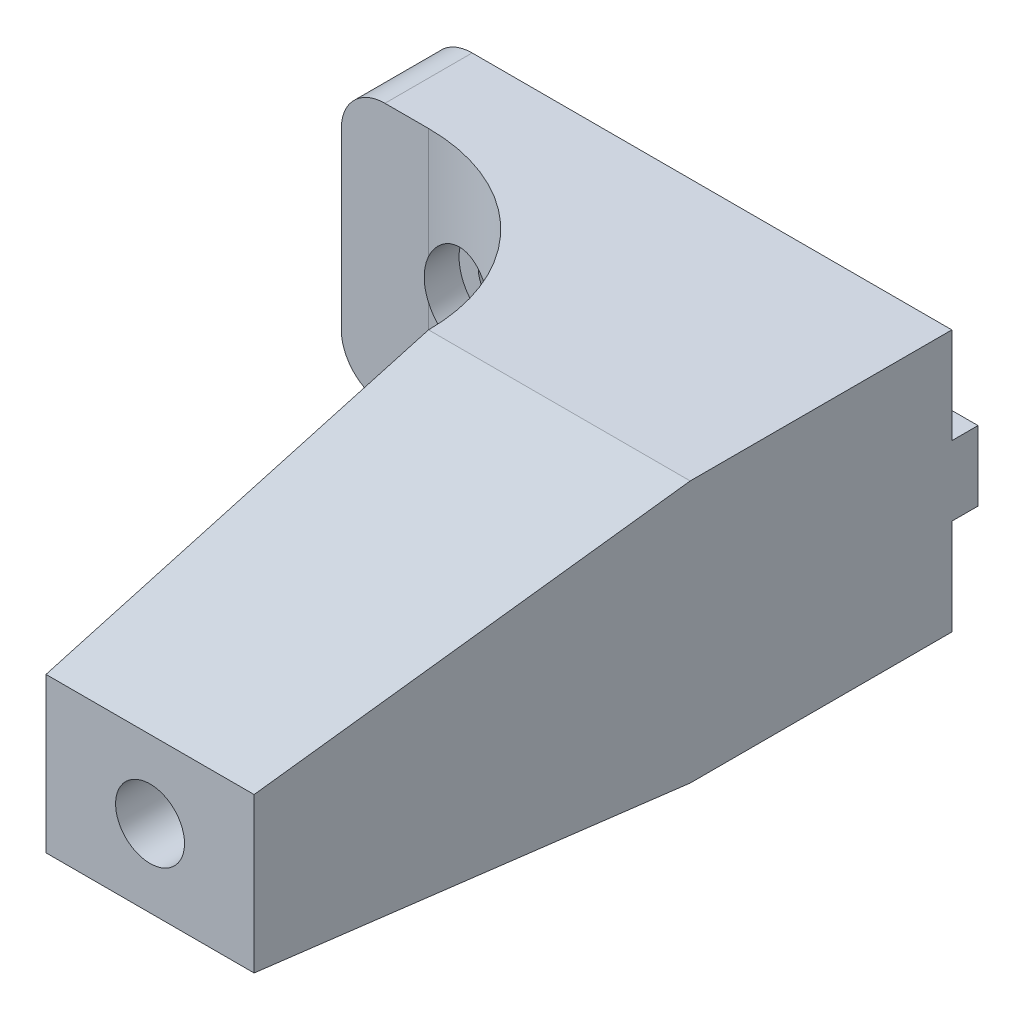
ISO-10303-21;
HEADER;
FILE_DESCRIPTION(('STEP AP214'),'2;1');
FILE_NAME('part.step','',(''),(''),'','','');
FILE_SCHEMA(('AUTOMOTIVE_DESIGN { 1 0 10303 214 1 1 1 1 }'));
ENDSEC;
DATA;
#1=APPLICATION_CONTEXT('core data for automotive mechanical design processes');
#2=APPLICATION_PROTOCOL_DEFINITION('international standard','automotive_design',2000,#1);
#3=PRODUCT_CONTEXT('',#1,'mechanical');
#4=PRODUCT('Part','Part','',(#3));
#5=PRODUCT_RELATED_PRODUCT_CATEGORY('part','',(#4));
#6=PRODUCT_DEFINITION_FORMATION('','',#4);
#7=PRODUCT_DEFINITION_CONTEXT('part definition',#1,'design');
#8=PRODUCT_DEFINITION('design','',#6,#7);
#9=PRODUCT_DEFINITION_SHAPE('','',#8);
#10=(LENGTH_UNIT() NAMED_UNIT(*) SI_UNIT(.MILLI.,.METRE.));
#11=(NAMED_UNIT(*) PLANE_ANGLE_UNIT() SI_UNIT($,.RADIAN.));
#12=(NAMED_UNIT(*) SI_UNIT($,.STERADIAN.) SOLID_ANGLE_UNIT());
#13=UNCERTAINTY_MEASURE_WITH_UNIT(LENGTH_MEASURE(1.E-05),#10,'distance_accuracy_value','');
#14=(GEOMETRIC_REPRESENTATION_CONTEXT(3) GLOBAL_UNCERTAINTY_ASSIGNED_CONTEXT((#13)) GLOBAL_UNIT_ASSIGNED_CONTEXT((#10,
#11,#12)) REPRESENTATION_CONTEXT('',''));
#15=CARTESIAN_POINT('',(0.,0.,0.));
#16=DIRECTION('',(0.,0.,1.));
#17=DIRECTION('',(1.,0.,0.));
#18=AXIS2_PLACEMENT_3D('',#15,#16,#17);
#19=CARTESIAN_POINT('',(0.,0.,0.));
#20=DIRECTION('',(0.,0.,1.));
#21=DIRECTION('',(1.,0.,0.));
#22=AXIS2_PLACEMENT_3D('',#19,#20,#21);
#23=PLANE('',#22);
#24=CARTESIAN_POINT('',(-15.,0.,0.));
#25=DIRECTION('',(0.,0.,1.));
#26=DIRECTION('',(1.,0.,0.));
#27=AXIS2_PLACEMENT_3D('',#24,#25,#26);
#28=CIRCLE('',#27,3.29999999999999);
#29=CARTESIAN_POINT('',(-11.7,0.,0.));
#30=VERTEX_POINT('',#29);
#31=EDGE_CURVE('E254',#30,#30,#28,.T.);
#32=ORIENTED_EDGE('',*,*,#31,.T.);
#33=EDGE_LOOP('',(#32));
#34=FACE_BOUND('',#33,.T.);
#35=DIRECTION('',(0.,-1.,0.));
#36=VECTOR('',#35,1.);
#37=CARTESIAN_POINT('',(-30.,15.,0.));
#38=LINE('',#37,#36);
#39=CARTESIAN_POINT('',(-30.,10.,0.));
#40=VERTEX_POINT('',#39);
#41=CARTESIAN_POINT('',(-30.,4.,0.));
#42=VERTEX_POINT('',#41);
#43=EDGE_CURVE('E277',#40,#42,#38,.T.);
#44=ORIENTED_EDGE('',*,*,#43,.F.);
#45=CARTESIAN_POINT('',(-25.,10.,0.));
#46=DIRECTION('',(0.,0.,1.));
#47=DIRECTION('',(1.,0.,0.));
#48=AXIS2_PLACEMENT_3D('',#45,#46,#47);
#49=CIRCLE('',#48,5.);
#50=CARTESIAN_POINT('',(-25.,15.,0.));
#51=VERTEX_POINT('',#50);
#52=EDGE_CURVE('E458',#40,#51,#49,.F.);
#53=ORIENTED_EDGE('',*,*,#52,.T.);
#54=DIRECTION('',(-1.,0.,0.));
#55=VECTOR('',#54,1.);
#56=CARTESIAN_POINT('',(-30.,15.,0.));
#57=LINE('',#56,#55);
#58=CARTESIAN_POINT('',(30.,15.,0.));
#59=VERTEX_POINT('',#58);
#60=EDGE_CURVE('E274',#59,#51,#57,.T.);
#61=ORIENTED_EDGE('',*,*,#60,.F.);
#62=DIRECTION('',(0.,1.,0.));
#63=VECTOR('',#62,1.);
#64=CARTESIAN_POINT('',(30.,15.,0.));
#65=LINE('',#64,#63);
#66=CARTESIAN_POINT('',(30.,4.,0.));
#67=VERTEX_POINT('',#66);
#68=EDGE_CURVE('E262',#67,#59,#65,.T.);
#69=ORIENTED_EDGE('',*,*,#68,.F.);
#70=DIRECTION('',(-1.,0.,0.));
#71=VECTOR('',#70,1.);
#72=CARTESIAN_POINT('',(0.,4.,0.));
#73=LINE('',#72,#71);
#74=CARTESIAN_POINT('',(-8.07179676972449,4.,0.));
#75=VERTEX_POINT('',#74);
#76=EDGE_CURVE('E227',#67,#75,#73,.T.);
#77=ORIENTED_EDGE('',*,*,#76,.T.);
#78=CARTESIAN_POINT('',(-15.,0.,0.));
#79=DIRECTION('',(0.,0.,-1.));
#80=DIRECTION('',(-1.,0.,0.));
#81=AXIS2_PLACEMENT_3D('',#78,#79,#80);
#82=CIRCLE('',#81,8.);
#83=CARTESIAN_POINT('',(-8.07179676972449,-4.,0.));
#84=VERTEX_POINT('',#83);
#85=EDGE_CURVE('E196',#75,#84,#82,.T.);
#86=ORIENTED_EDGE('',*,*,#85,.T.);
#87=DIRECTION('',(-1.,0.,0.));
#88=VECTOR('',#87,1.);
#89=CARTESIAN_POINT('',(0.,-4.,0.));
#90=LINE('',#89,#88);
#91=CARTESIAN_POINT('',(30.,-4.,0.));
#92=VERTEX_POINT('',#91);
#93=EDGE_CURVE('E217',#92,#84,#90,.T.);
#94=ORIENTED_EDGE('',*,*,#93,.F.);
#95=CARTESIAN_POINT('',(30.,-15.,0.));
#96=VERTEX_POINT('',#95);
#97=EDGE_CURVE('E271',#96,#92,#65,.T.);
#98=ORIENTED_EDGE('',*,*,#97,.F.);
#99=DIRECTION('',(1.,0.,0.));
#100=VECTOR('',#99,1.);
#101=CARTESIAN_POINT('',(-30.,-15.,0.));
#102=LINE('',#101,#100);
#103=CARTESIAN_POINT('',(-25.,-15.,0.));
#104=VERTEX_POINT('',#103);
#105=EDGE_CURVE('E266',#104,#96,#102,.T.);
#106=ORIENTED_EDGE('',*,*,#105,.F.);
#107=CARTESIAN_POINT('',(-25.,-10.,0.));
#108=DIRECTION('',(0.,0.,1.));
#109=DIRECTION('',(1.,0.,0.));
#110=AXIS2_PLACEMENT_3D('',#107,#108,#109);
#111=CIRCLE('',#110,5.);
#112=CARTESIAN_POINT('',(-30.,-10.,0.));
#113=VERTEX_POINT('',#112);
#114=EDGE_CURVE('E456',#104,#113,#111,.F.);
#115=ORIENTED_EDGE('',*,*,#114,.T.);
#116=CARTESIAN_POINT('',(-30.,-4.,0.));
#117=VERTEX_POINT('',#116);
#118=EDGE_CURVE('E276',#117,#113,#38,.T.);
#119=ORIENTED_EDGE('',*,*,#118,.F.);
#120=DIRECTION('',(-1.,0.,0.));
#121=VECTOR('',#120,1.);
#122=CARTESIAN_POINT('',(0.,-4.,0.));
#123=LINE('',#122,#121);
#124=CARTESIAN_POINT('',(-21.9282032302755,-4.,0.));
#125=VERTEX_POINT('',#124);
#126=EDGE_CURVE('E192',#125,#117,#123,.T.);
#127=ORIENTED_EDGE('',*,*,#126,.F.);
#128=CARTESIAN_POINT('',(-15.,0.,0.));
#129=DIRECTION('',(0.,0.,-1.));
#130=DIRECTION('',(-1.,0.,0.));
#131=AXIS2_PLACEMENT_3D('',#128,#129,#130);
#132=CIRCLE('',#131,8.);
#133=CARTESIAN_POINT('',(-21.9282032302755,4.,0.));
#134=VERTEX_POINT('',#133);
#135=EDGE_CURVE('E206',#125,#134,#132,.T.);
#136=ORIENTED_EDGE('',*,*,#135,.T.);
#137=DIRECTION('',(-1.,0.,0.));
#138=VECTOR('',#137,1.);
#139=CARTESIAN_POINT('',(0.,4.,0.));
#140=LINE('',#139,#138);
#141=EDGE_CURVE('E186',#134,#42,#140,.T.);
#142=ORIENTED_EDGE('',*,*,#141,.T.);
#143=EDGE_LOOP('',(#44,#53,#61,#69,#77,#86,#94,#98,#106,#115,#119,#127,#136,#142));
#144=FACE_BOUND('',#143,.T.);
#145=ADVANCED_FACE('F41',(#34,#144),#23,.F.);
#146=CARTESIAN_POINT('',(30.,15.,10.));
#147=DIRECTION('',(-1.,0.,0.));
#148=DIRECTION('',(0.,-1.,0.));
#149=AXIS2_PLACEMENT_3D('',#146,#147,#148);
#150=PLANE('',#149);
#151=DIRECTION('',(0.,0.,-1.));
#152=VECTOR('',#151,1.);
#153=CARTESIAN_POINT('',(30.,15.,10.));
#154=LINE('',#153,#152);
#155=CARTESIAN_POINT('',(30.,15.,29.9999999999986));
#156=VERTEX_POINT('',#155);
#157=EDGE_CURVE('E282',#156,#59,#154,.T.);
#158=ORIENTED_EDGE('',*,*,#157,.F.);
#159=DIRECTION('',(0.,0.121869343405144,-0.992546151641323));
#160=VECTOR('',#159,1.);
#161=CARTESIAN_POINT('',(30.,8.86077195485476,80.));
#162=LINE('',#161,#160);
#163=CARTESIAN_POINT('',(30.,8.86077195485476,80.));
#164=VERTEX_POINT('',#163);
#165=EDGE_CURVE('E355',#156,#164,#162,.F.);
#166=ORIENTED_EDGE('',*,*,#165,.T.);
#167=DIRECTION('',(0.,1.,0.));
#168=VECTOR('',#167,1.);
#169=CARTESIAN_POINT('',(30.,15.,80.));
#170=LINE('',#169,#168);
#171=CARTESIAN_POINT('',(30.,-8.86077195485476,80.));
#172=VERTEX_POINT('',#171);
#173=EDGE_CURVE('E259',#172,#164,#170,.T.);
#174=ORIENTED_EDGE('',*,*,#173,.F.);
#175=DIRECTION('',(0.,0.121869343405144,0.992546151641323));
#176=VECTOR('',#175,1.);
#177=CARTESIAN_POINT('',(30.,-8.86077195485476,80.));
#178=LINE('',#177,#176);
#179=CARTESIAN_POINT('',(30.,-15.,29.9999999999986));
#180=VERTEX_POINT('',#179);
#181=EDGE_CURVE('E367',#172,#180,#178,.F.);
#182=ORIENTED_EDGE('',*,*,#181,.T.);
#183=DIRECTION('',(0.,0.,-1.));
#184=VECTOR('',#183,1.);
#185=CARTESIAN_POINT('',(30.,-15.,10.));
#186=LINE('',#185,#184);
#187=EDGE_CURVE('E270',#180,#96,#186,.T.);
#188=ORIENTED_EDGE('',*,*,#187,.T.);
#189=ORIENTED_EDGE('',*,*,#97,.T.);
#190=DIRECTION('',(0.,0.,1.));
#191=VECTOR('',#190,1.);
#192=CARTESIAN_POINT('',(30.,-4.,-3.));
#193=LINE('',#192,#191);
#194=CARTESIAN_POINT('',(30.,-4.,-3.));
#195=VERTEX_POINT('',#194);
#196=EDGE_CURVE('E233',#195,#92,#193,.T.);
#197=ORIENTED_EDGE('',*,*,#196,.F.);
#198=DIRECTION('',(0.,-1.,0.));
#199=VECTOR('',#198,1.);
#200=CARTESIAN_POINT('',(30.,0.,-3.));
#201=LINE('',#200,#199);
#202=CARTESIAN_POINT('',(30.,4.,-3.));
#203=VERTEX_POINT('',#202);
#204=EDGE_CURVE('E220',#203,#195,#201,.T.);
#205=ORIENTED_EDGE('',*,*,#204,.F.);
#206=DIRECTION('',(0.,0.,1.));
#207=VECTOR('',#206,1.);
#208=CARTESIAN_POINT('',(30.,4.,-3.));
#209=LINE('',#208,#207);
#210=EDGE_CURVE('E235',#203,#67,#209,.T.);
#211=ORIENTED_EDGE('',*,*,#210,.T.);
#212=ORIENTED_EDGE('',*,*,#68,.T.);
#213=EDGE_LOOP('',(#158,#166,#174,#182,#188,#189,#197,#205,#211,#212));
#214=FACE_BOUND('',#213,.T.);
#215=ADVANCED_FACE('F339',(#214),#150,.F.);
#216=CARTESIAN_POINT('',(-30.,15.,10.));
#217=DIRECTION('',(0.,-1.,0.));
#218=DIRECTION('',(0.,0.,-1.));
#219=AXIS2_PLACEMENT_3D('',#216,#217,#218);
#220=PLANE('',#219);
#221=ORIENTED_EDGE('',*,*,#60,.T.);
#222=DIRECTION('',(0.,0.,-1.));
#223=VECTOR('',#222,1.);
#224=CARTESIAN_POINT('',(-25.,15.,10.));
#225=LINE('',#224,#223);
#226=CARTESIAN_POINT('',(-25.,15.,10.));
#227=VERTEX_POINT('',#226);
#228=EDGE_CURVE('E64',#51,#227,#225,.F.);
#229=ORIENTED_EDGE('',*,*,#228,.T.);
#230=DIRECTION('',(-1.,0.,0.));
#231=VECTOR('',#230,1.);
#232=CARTESIAN_POINT('',(-30.,15.,10.));
#233=LINE('',#232,#231);
#234=CARTESIAN_POINT('',(-20.,15.,10.));
#235=VERTEX_POINT('',#234);
#236=EDGE_CURVE('E263',#235,#227,#233,.T.);
#237=ORIENTED_EDGE('',*,*,#236,.F.);
#238=CARTESIAN_POINT('',(-20.,15.,30.));
#239=DIRECTION('',(0.,-1.,0.));
#240=DIRECTION('',(0.,0.,-1.));
#241=AXIS2_PLACEMENT_3D('',#238,#239,#240);
#242=CIRCLE('',#241,20.);
#243=CARTESIAN_POINT('',(0.,15.,30.));
#244=VERTEX_POINT('',#243);
#245=EDGE_CURVE('E295',#235,#244,#242,.T.);
#246=ORIENTED_EDGE('',*,*,#245,.T.);
#247=DIRECTION('',(1.,0.,0.));
#248=VECTOR('',#247,1.);
#249=CARTESIAN_POINT('',(-30.,15.,29.9999999999986));
#250=LINE('',#249,#248);
#251=EDGE_CURVE('E362',#244,#156,#250,.T.);
#252=ORIENTED_EDGE('',*,*,#251,.T.);
#253=ORIENTED_EDGE('',*,*,#157,.T.);
#254=EDGE_LOOP('',(#221,#229,#237,#246,#252,#253));
#255=FACE_BOUND('',#254,.T.);
#256=ADVANCED_FACE('F346',(#255),#220,.F.);
#257=CARTESIAN_POINT('',(-30.,15.,10.));
#258=DIRECTION('',(1.,0.,0.));
#259=DIRECTION('',(0.,1.,0.));
#260=AXIS2_PLACEMENT_3D('',#257,#258,#259);
#261=PLANE('',#260);
#262=DIRECTION('',(0.,-1.,0.));
#263=VECTOR('',#262,1.);
#264=CARTESIAN_POINT('',(-30.,15.,10.));
#265=LINE('',#264,#263);
#266=CARTESIAN_POINT('',(-30.,10.,10.));
#267=VERTEX_POINT('',#266);
#268=CARTESIAN_POINT('',(-30.,-10.,10.));
#269=VERTEX_POINT('',#268);
#270=EDGE_CURVE('E265',#267,#269,#265,.T.);
#271=ORIENTED_EDGE('',*,*,#270,.F.);
#272=DIRECTION('',(0.,0.,-1.));
#273=VECTOR('',#272,1.);
#274=CARTESIAN_POINT('',(-30.,10.,10.));
#275=LINE('',#274,#273);
#276=EDGE_CURVE('E459',#267,#40,#275,.T.);
#277=ORIENTED_EDGE('',*,*,#276,.T.);
#278=ORIENTED_EDGE('',*,*,#43,.T.);
#279=DIRECTION('',(0.,0.,1.));
#280=VECTOR('',#279,1.);
#281=CARTESIAN_POINT('',(-30.,4.,-3.));
#282=LINE('',#281,#280);
#283=CARTESIAN_POINT('',(-30.,4.,-3.));
#284=VERTEX_POINT('',#283);
#285=EDGE_CURVE('E197',#284,#42,#282,.T.);
#286=ORIENTED_EDGE('',*,*,#285,.F.);
#287=DIRECTION('',(0.,1.,0.));
#288=VECTOR('',#287,1.);
#289=CARTESIAN_POINT('',(-30.,0.,-3.));
#290=LINE('',#289,#288);
#291=CARTESIAN_POINT('',(-30.,-4.,-3.));
#292=VERTEX_POINT('',#291);
#293=EDGE_CURVE('E180',#292,#284,#290,.T.);
#294=ORIENTED_EDGE('',*,*,#293,.F.);
#295=DIRECTION('',(0.,0.,1.));
#296=VECTOR('',#295,1.);
#297=CARTESIAN_POINT('',(-30.,-4.,-3.));
#298=LINE('',#297,#296);
#299=EDGE_CURVE('E189',#292,#117,#298,.T.);
#300=ORIENTED_EDGE('',*,*,#299,.T.);
#301=ORIENTED_EDGE('',*,*,#118,.T.);
#302=DIRECTION('',(0.,0.,-1.));
#303=VECTOR('',#302,1.);
#304=CARTESIAN_POINT('',(-30.,-10.,10.));
#305=LINE('',#304,#303);
#306=EDGE_CURVE('E408',#113,#269,#305,.F.);
#307=ORIENTED_EDGE('',*,*,#306,.T.);
#308=EDGE_LOOP('',(#271,#277,#278,#286,#294,#300,#301,#307));
#309=FACE_BOUND('',#308,.T.);
#310=ADVANCED_FACE('F200',(#309),#261,.F.);
#311=CARTESIAN_POINT('',(-30.,-15.,10.));
#312=DIRECTION('',(0.,1.,0.));
#313=DIRECTION('',(0.,0.,1.));
#314=AXIS2_PLACEMENT_3D('',#311,#312,#313);
#315=PLANE('',#314);
#316=DIRECTION('',(1.,0.,0.));
#317=VECTOR('',#316,1.);
#318=CARTESIAN_POINT('',(-30.,-15.,10.));
#319=LINE('',#318,#317);
#320=CARTESIAN_POINT('',(-25.,-15.,10.));
#321=VERTEX_POINT('',#320);
#322=CARTESIAN_POINT('',(-20.,-15.,10.));
#323=VERTEX_POINT('',#322);
#324=EDGE_CURVE('E268',#321,#323,#319,.T.);
#325=ORIENTED_EDGE('',*,*,#324,.F.);
#326=DIRECTION('',(0.,0.,-1.));
#327=VECTOR('',#326,1.);
#328=CARTESIAN_POINT('',(-25.,-15.,10.));
#329=LINE('',#328,#327);
#330=EDGE_CURVE('E11',#321,#104,#329,.T.);
#331=ORIENTED_EDGE('',*,*,#330,.T.);
#332=ORIENTED_EDGE('',*,*,#105,.T.);
#333=ORIENTED_EDGE('',*,*,#187,.F.);
#334=DIRECTION('',(-1.,0.,0.));
#335=VECTOR('',#334,1.);
#336=CARTESIAN_POINT('',(-30.,-15.,29.9999999999986));
#337=LINE('',#336,#335);
#338=CARTESIAN_POINT('',(0.,-15.,30.));
#339=VERTEX_POINT('',#338);
#340=EDGE_CURVE('E366',#180,#339,#337,.T.);
#341=ORIENTED_EDGE('',*,*,#340,.T.);
#342=CARTESIAN_POINT('',(-20.,-15.,30.));
#343=DIRECTION('',(0.,1.,0.));
#344=DIRECTION('',(0.,0.,1.));
#345=AXIS2_PLACEMENT_3D('',#342,#343,#344);
#346=CIRCLE('',#345,20.);
#347=EDGE_CURVE('E292',#339,#323,#346,.T.);
#348=ORIENTED_EDGE('',*,*,#347,.T.);
#349=EDGE_LOOP('',(#325,#331,#332,#333,#341,#348));
#350=FACE_BOUND('',#349,.T.);
#351=ADVANCED_FACE('F336',(#350),#315,.F.);
#352=CARTESIAN_POINT('',(0.,0.,10.));
#353=DIRECTION('',(0.,0.,1.));
#354=DIRECTION('',(1.,0.,0.));
#355=AXIS2_PLACEMENT_3D('',#352,#353,#354);
#356=PLANE('',#355);
#357=ORIENTED_EDGE('',*,*,#236,.T.);
#358=CARTESIAN_POINT('',(-25.,10.,10.));
#359=DIRECTION('',(0.,0.,1.));
#360=DIRECTION('',(1.,0.,0.));
#361=AXIS2_PLACEMENT_3D('',#358,#359,#360);
#362=CIRCLE('',#361,5.);
#363=EDGE_CURVE('E49',#227,#267,#362,.T.);
#364=ORIENTED_EDGE('',*,*,#363,.T.);
#365=ORIENTED_EDGE('',*,*,#270,.T.);
#366=CARTESIAN_POINT('',(-25.,-10.,10.));
#367=DIRECTION('',(0.,0.,1.));
#368=DIRECTION('',(1.,0.,0.));
#369=AXIS2_PLACEMENT_3D('',#366,#367,#368);
#370=CIRCLE('',#369,5.);
#371=EDGE_CURVE('E56',#269,#321,#370,.T.);
#372=ORIENTED_EDGE('',*,*,#371,.T.);
#373=ORIENTED_EDGE('',*,*,#324,.T.);
#374=DIRECTION('',(0.,-1.,0.));
#375=VECTOR('',#374,1.);
#376=CARTESIAN_POINT('',(-20.,0.,10.));
#377=LINE('',#376,#375);
#378=CARTESIAN_POINT('',(-20.,-2.29128784747789,10.));
#379=VERTEX_POINT('',#378);
#380=EDGE_CURVE('E289',#323,#379,#377,.F.);
#381=ORIENTED_EDGE('',*,*,#380,.T.);
#382=CARTESIAN_POINT('',(-15.,0.,10.));
#383=DIRECTION('',(0.,0.,1.));
#384=DIRECTION('',(1.,0.,0.));
#385=AXIS2_PLACEMENT_3D('',#382,#383,#384);
#386=CIRCLE('',#385,5.49999999999999);
#387=CARTESIAN_POINT('',(-20.,2.29128784747789,10.));
#388=VERTEX_POINT('',#387);
#389=EDGE_CURVE('E257',#388,#379,#386,.T.);
#390=ORIENTED_EDGE('',*,*,#389,.F.);
#391=EDGE_CURVE('E288',#388,#235,#377,.F.);
#392=ORIENTED_EDGE('',*,*,#391,.T.);
#393=EDGE_LOOP('',(#357,#364,#365,#372,#373,#381,#390,#392));
#394=FACE_BOUND('',#393,.T.);
#395=ADVANCED_FACE('F332',(#394),#356,.T.);
#396=CARTESIAN_POINT('',(0.,0.,80.));
#397=DIRECTION('',(0.,0.,-1.));
#398=DIRECTION('',(-1.,0.,0.));
#399=AXIS2_PLACEMENT_3D('',#396,#397,#398);
#400=PLANE('',#399);
#401=CARTESIAN_POINT('',(18.0696140225726,0.,80.));
#402=DIRECTION('',(0.,0.,1.));
#403=DIRECTION('',(1.,0.,0.));
#404=AXIS2_PLACEMENT_3D('',#401,#402,#403);
#405=CIRCLE('',#404,3.95);
#406=CARTESIAN_POINT('',(22.0196140225726,0.,80.));
#407=VERTEX_POINT('',#406);
#408=EDGE_CURVE('E240',#407,#407,#405,.T.);
#409=ORIENTED_EDGE('',*,*,#408,.F.);
#410=EDGE_LOOP('',(#409));
#411=FACE_BOUND('',#410,.T.);
#412=ORIENTED_EDGE('',*,*,#173,.T.);
#413=DIRECTION('',(-1.,0.,0.));
#414=VECTOR('',#413,1.);
#415=CARTESIAN_POINT('',(0.,8.86077195485476,80.));
#416=LINE('',#415,#414);
#417=CARTESIAN_POINT('',(6.13922804514523,8.86077195485476,80.));
#418=VERTEX_POINT('',#417);
#419=EDGE_CURVE('E365',#164,#418,#416,.T.);
#420=ORIENTED_EDGE('',*,*,#419,.T.);
#421=DIRECTION('',(0.,-1.,0.));
#422=VECTOR('',#421,1.);
#423=CARTESIAN_POINT('',(6.13922804514523,0.,80.));
#424=LINE('',#423,#422);
#425=CARTESIAN_POINT('',(6.13922804514523,-8.86077195485476,80.));
#426=VERTEX_POINT('',#425);
#427=EDGE_CURVE('E710',#418,#426,#424,.T.);
#428=ORIENTED_EDGE('',*,*,#427,.T.);
#429=DIRECTION('',(1.,0.,0.));
#430=VECTOR('',#429,1.);
#431=CARTESIAN_POINT('',(0.,-8.86077195485476,80.));
#432=LINE('',#431,#430);
#433=EDGE_CURVE('E306',#426,#172,#432,.T.);
#434=ORIENTED_EDGE('',*,*,#433,.T.);
#435=EDGE_LOOP('',(#412,#420,#428,#434));
#436=FACE_BOUND('',#435,.T.);
#437=ADVANCED_FACE('F329',(#411,#436),#400,.F.);
#438=CARTESIAN_POINT('',(-20.,15.,30.));
#439=DIRECTION('',(0.,-1.,0.));
#440=DIRECTION('',(0.,0.,-1.));
#441=AXIS2_PLACEMENT_3D('',#438,#439,#440);
#442=CYLINDRICAL_SURFACE('',#441,20.);
#443=ORIENTED_EDGE('',*,*,#391,.F.);
#444=CARTESIAN_POINT('',(-20.,2.29128784747789,10.));
#445=CARTESIAN_POINT('',(-19.9361654619844,2.43062605850626,10.0000057711088));
#446=CARTESIAN_POINT('',(-19.8664774038517,2.56728185711241,10.0003055754939));
#447=CARTESIAN_POINT('',(-19.715948489605,2.83430253964469,10.0018740850183));
#448=CARTESIAN_POINT('',(-19.6351075055899,2.964667351403,10.0031428012699));
#449=CARTESIAN_POINT('',(-19.4628392531842,3.21816086646834,10.0070297427975));
#450=CARTESIAN_POINT('',(-19.3714133110938,3.34129047344157,10.0096477991423));
#451=CARTESIAN_POINT('',(-19.178631511944,3.5794561282108,10.0166404643934));
#452=CARTESIAN_POINT('',(-19.0772759437645,3.69449241129651,10.0210150222099));
#453=CARTESIAN_POINT('',(-18.8652961097963,3.9157342073468,10.0319326429312));
#454=CARTESIAN_POINT('',(-18.7546651538316,4.02193323421238,10.0384772813076));
#455=CARTESIAN_POINT('',(-18.5249846107319,4.2246842122284,10.0541337462558));
#456=CARTESIAN_POINT('',(-18.4059319372996,4.32123259511341,10.0632465176571));
#457=CARTESIAN_POINT('',(-18.160466459884,4.50386865692049,10.0843962113873));
#458=CARTESIAN_POINT('',(-18.0340603717538,4.58996566589278,10.0964304964226));
#459=CARTESIAN_POINT('',(-17.7747282936151,4.75123202196848,10.1237536725669));
#460=CARTESIAN_POINT('',(-17.6417999545447,4.82639739270589,10.1390437430043));
#461=CARTESIAN_POINT('',(-17.3720796988876,4.96446640374367,10.1729403528298));
#462=CARTESIAN_POINT('',(-17.2353498331652,5.02750117411441,10.1915067095413));
#463=CARTESIAN_POINT('',(-16.9575994760525,5.14202074646928,10.2322610004086));
#464=CARTESIAN_POINT('',(-16.8165774406139,5.19350133487048,10.2544502506832));
#465=CARTESIAN_POINT('',(-16.5314101127013,5.2846177400456,10.3025436465792));
#466=CARTESIAN_POINT('',(-16.3872654573414,5.32425594908033,10.3284470403454));
#467=CARTESIAN_POINT('',(-16.096865890783,5.39157773052972,10.3840012618108));
#468=CARTESIAN_POINT('',(-15.9506102124335,5.41925683787082,10.413653483848));
#469=CARTESIAN_POINT('',(-15.6570824518885,5.46262371184985,10.4766395678238));
#470=CARTESIAN_POINT('',(-15.5098101295151,5.4783085397369,10.5099743297433));
#471=CARTESIAN_POINT('',(-15.2152730472317,5.49776791738599,10.580182212215));
#472=CARTESIAN_POINT('',(-15.0680083092668,5.50153816315329,10.6170566064602));
#473=CARTESIAN_POINT('',(-14.7745562222178,5.49733514678916,10.6941012718699));
#474=CARTESIAN_POINT('',(-14.6283685598328,5.48936544701988,10.7342705397476));
#475=CARTESIAN_POINT('',(-14.3379214921169,5.46195610641278,10.8176183904925));
#476=CARTESIAN_POINT('',(-14.1936628391439,5.44251211652089,10.8607981089234));
#477=CARTESIAN_POINT('',(-13.7524936135484,5.36519140614237,10.9982670476814));
#478=CARTESIAN_POINT('',(-13.4600688816565,5.28851193514234,11.0971012665077));
#479=CARTESIAN_POINT('',(-12.8941255406996,5.08973945133075,11.3024733318376));
#480=CARTESIAN_POINT('',(-12.6206142799366,4.96762890379745,11.4090141399939));
#481=CARTESIAN_POINT('',(-12.0791161859918,4.67122972594027,11.6328724073047));
#482=CARTESIAN_POINT('',(-11.812918286371,4.49383798612687,11.7504161646302));
#483=CARTESIAN_POINT('',(-11.3141065962897,4.09465507030501,11.9824815142942));
#484=CARTESIAN_POINT('',(-11.0815116776032,3.87283911077673,12.0970013791092));
#485=CARTESIAN_POINT('',(-10.7599292538816,3.5070183591231,12.2620109970086));
#486=CARTESIAN_POINT('',(-10.6560960043052,3.37760520017965,12.3165648219871));
#487=CARTESIAN_POINT('',(-10.4598887726233,3.10886329554582,12.4216432625865));
#488=CARTESIAN_POINT('',(-10.3675095764345,2.9695391073205,12.4721697077717));
#489=CARTESIAN_POINT('',(-10.1951876885678,2.68177198772662,12.5679781412236));
#490=CARTESIAN_POINT('',(-10.1152400696383,2.53333270183142,12.6132622054786));
#491=CARTESIAN_POINT('',(-9.96873799016142,2.22823310007868,12.6973724201297));
#492=CARTESIAN_POINT('',(-9.90218154941246,2.07157400403984,12.736199525192));
#493=CARTESIAN_POINT('',(-9.78890874902001,1.76595462641501,12.8029788655388));
#494=CARTESIAN_POINT('',(-9.74093185874868,1.61760806918704,12.8316022568513));
#495=CARTESIAN_POINT('',(-9.65753865354463,1.31625841125111,12.8817096151663));
#496=CARTESIAN_POINT('',(-9.62212011071132,1.1632561417197,12.9031948484637));
#497=CARTESIAN_POINT('',(-9.56444282816827,0.854063602648121,12.9383385920533));
#498=CARTESIAN_POINT('',(-9.54217062656181,0.697876764314685,12.9520051082948));
#499=CARTESIAN_POINT('',(-9.5111289174085,0.383672646777804,12.9710857005589));
#500=CARTESIAN_POINT('',(-9.50235759615863,0.225655616315759,12.9765008850612));
#501=CARTESIAN_POINT('',(-9.49873858534418,-0.068866268121932,12.9787338480942));
#502=CARTESIAN_POINT('',(-9.50214429166971,-0.205345462591226,12.9766301155721));
#503=CARTESIAN_POINT('',(-9.51906946109802,-0.477481409372782,12.9662043006356));
#504=CARTESIAN_POINT('',(-9.53259198124264,-0.613137900591773,12.9578803386282));
#505=CARTESIAN_POINT('',(-9.56956494367959,-0.882527941616192,12.9352265924987));
#506=CARTESIAN_POINT('',(-9.59301193419748,-1.01626214329709,12.9208988965191));
#507=CARTESIAN_POINT('',(-9.64954153550882,-1.28098493804623,12.8865812556122));
#508=CARTESIAN_POINT('',(-9.68262789336571,-1.41197244213807,12.8665891088543));
#509=CARTESIAN_POINT('',(-9.7573377805858,-1.66791091685514,12.8218240825608));
#510=CARTESIAN_POINT('',(-9.79878961753192,-1.79292902086901,12.7971478637656));
#511=CARTESIAN_POINT('',(-9.89017177929902,-2.03884379825391,12.7432858177026));
#512=CARTESIAN_POINT('',(-9.94010503587177,-2.15973902907087,12.7140984313858));
#513=CARTESIAN_POINT('',(-10.1019487483417,-2.51531868055695,12.620583604862));
#514=CARTESIAN_POINT('',(-10.2259504552907,-2.74305695640224,12.5502744841527));
#515=CARTESIAN_POINT('',(-10.5178330454116,-3.20028354486295,12.3897994227716));
#516=CARTESIAN_POINT('',(-10.6890625513743,-3.42714258090962,12.29829413635));
#517=CARTESIAN_POINT('',(-11.062212953338,-3.8501195576521,12.1069863914958));
#518=CARTESIAN_POINT('',(-11.2641519933466,-4.04621918480526,12.007179043883));
#519=CARTESIAN_POINT('',(-11.7220492978507,-4.42773569844362,11.7915563318849));
#520=CARTESIAN_POINT('',(-11.9816124118714,-4.60859858337005,11.6753230779945));
#521=CARTESIAN_POINT('',(-12.5289753513119,-4.92378586210093,11.4454401021175));
#522=CARTESIAN_POINT('',(-12.8167846906452,-5.05809450596713,11.3317912666017));
#523=CARTESIAN_POINT('',(-13.2702597169344,-5.22353549481145,11.1655078743397));
#524=CARTESIAN_POINT('',(-13.4282387028878,-5.27324701931897,11.1097725225974));
#525=CARTESIAN_POINT('',(-13.7489610634074,-5.35839438110484,11.0012344289706));
#526=CARTESIAN_POINT('',(-13.9117025719744,-5.39383573131836,10.9484305613884));
#527=CARTESIAN_POINT('',(-14.2407919988716,-5.4499054918583,10.8463784941055));
#528=CARTESIAN_POINT('',(-14.4071395659776,-5.47053533818283,10.7971299501272));
#529=CARTESIAN_POINT('',(-14.7421712880078,-5.4965211483259,10.7027071273777));
#530=CARTESIAN_POINT('',(-14.910855271818,-5.50187822480785,10.6575325520388));
#531=CARTESIAN_POINT('',(-15.2396686438288,-5.49709589931227,10.574079357629));
#532=CARTESIAN_POINT('',(-15.3997486037062,-5.48780676875315,10.5355563227706));
#533=CARTESIAN_POINT('',(-15.7194314336196,-5.4551103946402,10.4627637545461));
#534=CARTESIAN_POINT('',(-15.8790343352813,-5.43170410879354,10.4284939328325));
#535=CARTESIAN_POINT('',(-16.1963520439806,-5.37073873510063,10.3643574971084));
#536=CARTESIAN_POINT('',(-16.3540675174486,-5.33318480445992,10.3344892841034));
#537=CARTESIAN_POINT('',(-16.6662689883488,-5.24403446112156,10.2791641284288));
#538=CARTESIAN_POINT('',(-16.8207551483548,-5.19243875717343,10.2537069632205));
#539=CARTESIAN_POINT('',(-17.1150986958776,-5.07932683874936,10.208637161826));
#540=CARTESIAN_POINT('',(-17.2552506511713,-5.01868424313913,10.1887505561343));
#541=CARTESIAN_POINT('',(-17.5303925689355,-4.88573996879825,10.1525746882285));
#542=CARTESIAN_POINT('',(-17.6653826864666,-4.81343864063448,10.1362853178837));
#543=CARTESIAN_POINT('',(-17.9291539257368,-4.65763099784936,10.1070562164466));
#544=CARTESIAN_POINT('',(-18.0579336438188,-4.57412216612428,10.0941172397401));
#545=CARTESIAN_POINT('',(-18.30823390498,-4.39649156653977,10.0712839582502));
#546=CARTESIAN_POINT('',(-18.4297546380785,-4.30237007667586,10.0613895737398));
#547=CARTESIAN_POINT('',(-18.6625481923702,-4.10591439061921,10.0444341441525));
#548=CARTESIAN_POINT('',(-18.7739627869111,-4.00375207194709,10.0373266906045));
#549=CARTESIAN_POINT('',(-18.9880611059075,-3.79053975524037,10.0253290944056));
#550=CARTESIAN_POINT('',(-19.090745010532,-3.67948994070248,10.0204389059896));
#551=CARTESIAN_POINT('',(-19.2865342420972,-3.4494084557395,10.0124899306197));
#552=CARTESIAN_POINT('',(-19.3796503287719,-3.33038600568951,10.0094290673652));
#553=CARTESIAN_POINT('',(-19.5557517142399,-3.0851101044012,10.0047405524649));
#554=CARTESIAN_POINT('',(-19.6387415555508,-2.95885993305544,10.003112256135));
#555=CARTESIAN_POINT('',(-19.7686208326201,-2.74236535621996,10.0012701760986));
#556=CARTESIAN_POINT('',(-19.8184347851558,-2.65386298675419,10.000767838158));
#557=CARTESIAN_POINT('',(-19.9130088078203,-2.4743926245188,10.0001337019938));
#558=CARTESIAN_POINT('',(-19.9577774880986,-2.38342917125468,10.0000012630295));
#559=CARTESIAN_POINT('',(-20.,-2.29128784747789,10.));
#560=B_SPLINE_CURVE_WITH_KNOTS('',3,(#444,#445,#446,#447,#448,#449,#450,#451,#452,#453,#454,
#455,#456,#457,#458,#459,#460,#461,#462,#463,#464,#465,#466,#467,#468,#469,#470,#471,#472,#473,
#474,#475,#476,#477,#478,#479,#480,#481,#482,#483,#484,#485,#486,#487,#488,#489,#490,#491,#492,
#493,#494,#495,#496,#497,#498,#499,#500,#501,#502,#503,#504,#505,#506,#507,#508,#509,#510,#511,
#512,#513,#514,#515,#516,#517,#518,#519,#520,#521,#522,#523,#524,#525,#526,#527,#528,#529,#530,
#531,#532,#533,#534,#535,#536,#537,#538,#539,#540,#541,#542,#543,#544,#545,#546,#547,#548,#549,
#550,#551,#552,#553,#554,#555,#556,#557,#558,#559),.UNSPECIFIED.,.F.,.F.,(4,2,2,2,2,2,2,2,2,2,2,
2,2,2,2,2,2,2,2,2,2,2,2,2,2,2,2,2,2,2,2,2,2,2,2,2,2,2,2,2,2,2,2,2,2,2,2,2,2,2,2,2,2,2,2,2,2,4),
(0.,0.459658816385987,0.919322904550574,1.37892945879438,1.8385226457974,2.29845022924155,
2.75854724383879,3.21823045643804,3.67808046209416,4.13263953855898,4.58736411539689,
5.04199677181672,5.49679902439931,5.95171267364173,6.40679063601365,6.86173053823932,
7.31684298535979,8.26656912998052,9.21666221481433,10.2345949286669,11.2530971198191,
11.7764903479193,12.2996444367409,12.8225906421631,13.3454594607304,13.8203221773596,
14.2951006092623,14.7693920192399,15.2436197075307,15.6527260418123,16.0619560474991,
16.4710438379941,16.8802908638202,17.2818649880388,17.68357820696,18.4865022407629,
19.3788393540586,20.2717057469501,21.2784730236586,22.2855805718642,22.8092478678038,
23.332712663048,23.8561267007188,24.3795026052588,24.8735951622802,25.3676542038544,
25.8615333213148,26.3553875151649,26.8168212501256,27.2782411128037,27.739764780166,
28.2012763608558,28.6547383552904,29.1081909896845,29.5611279689594,30.0138610130245,
30.3183937897619,30.6223987252862),.UNSPECIFIED.);
#561=EDGE_CURVE('E297',#388,#379,#560,.T.);
#562=ORIENTED_EDGE('',*,*,#561,.T.);
#563=ORIENTED_EDGE('',*,*,#380,.F.);
#564=ORIENTED_EDGE('',*,*,#347,.F.);
#565=DIRECTION('',(0.,-1.,0.));
#566=VECTOR('',#565,1.);
#567=CARTESIAN_POINT('',(0.,15.,30.));
#568=LINE('',#567,#566);
#569=EDGE_CURVE('E285',#244,#339,#568,.T.);
#570=ORIENTED_EDGE('',*,*,#569,.F.);
#571=ORIENTED_EDGE('',*,*,#245,.F.);
#572=EDGE_LOOP('',(#443,#562,#563,#564,#570,#571));
#573=FACE_BOUND('',#572,.T.);
#574=ADVANCED_FACE('F308',(#573),#442,.F.);
#575=CARTESIAN_POINT('',(-15.,0.,30.));
#576=DIRECTION('',(0.,0.,1.));
#577=DIRECTION('',(1.,0.,0.));
#578=AXIS2_PLACEMENT_3D('',#575,#576,#577);
#579=CYLINDRICAL_SURFACE('',#578,3.29999999999999);
#580=ORIENTED_EDGE('',*,*,#31,.F.);
#581=EDGE_LOOP('',(#580));
#582=FACE_BOUND('',#581,.T.);
#583=CARTESIAN_POINT('',(-15.,0.,6.));
#584=DIRECTION('',(0.,0.,1.));
#585=DIRECTION('',(1.,0.,0.));
#586=AXIS2_PLACEMENT_3D('',#583,#584,#585);
#587=CIRCLE('',#586,3.3);
#588=CARTESIAN_POINT('',(-11.7,0.,6.));
#589=VERTEX_POINT('',#588);
#590=EDGE_CURVE('E250',#589,#589,#587,.T.);
#591=ORIENTED_EDGE('',*,*,#590,.T.);
#592=EDGE_LOOP('',(#591));
#593=FACE_BOUND('',#592,.T.);
#594=ADVANCED_FACE('F324',(#582,#593),#579,.F.);
#595=CARTESIAN_POINT('',(-11.7,0.,6.));
#596=DIRECTION('',(0.,0.,-1.));
#597=DIRECTION('',(-1.,0.,0.));
#598=AXIS2_PLACEMENT_3D('',#595,#596,#597);
#599=PLANE('',#598);
#600=ORIENTED_EDGE('',*,*,#590,.F.);
#601=EDGE_LOOP('',(#600));
#602=FACE_BOUND('',#601,.T.);
#603=CARTESIAN_POINT('',(-15.,0.,6.));
#604=DIRECTION('',(0.,0.,1.));
#605=DIRECTION('',(1.,0.,0.));
#606=AXIS2_PLACEMENT_3D('',#603,#604,#605);
#607=CIRCLE('',#606,5.49999999999999);
#608=CARTESIAN_POINT('',(-9.50000000000001,0.,6.));
#609=VERTEX_POINT('',#608);
#610=EDGE_CURVE('E247',#609,#609,#607,.T.);
#611=ORIENTED_EDGE('',*,*,#610,.T.);
#612=EDGE_LOOP('',(#611));
#613=FACE_BOUND('',#612,.T.);
#614=ADVANCED_FACE('F318',(#602,#613),#599,.F.);
#615=CARTESIAN_POINT('',(-15.,0.,30.));
#616=DIRECTION('',(0.,0.,1.));
#617=DIRECTION('',(1.,0.,0.));
#618=AXIS2_PLACEMENT_3D('',#615,#616,#617);
#619=CYLINDRICAL_SURFACE('',#618,5.49999999999999);
#620=ORIENTED_EDGE('',*,*,#389,.T.);
#621=ORIENTED_EDGE('',*,*,#561,.F.);
#622=EDGE_LOOP('',(#620,#621));
#623=FACE_BOUND('',#622,.T.);
#624=ORIENTED_EDGE('',*,*,#610,.F.);
#625=EDGE_LOOP('',(#624));
#626=FACE_BOUND('',#625,.T.);
#627=ADVANCED_FACE('F312',(#623,#626),#619,.F.);
#628=CARTESIAN_POINT('',(0.,-8.86077195485476,80.));
#629=DIRECTION('',(0.,0.992546151641322,-0.121869343405144));
#630=DIRECTION('',(1.,0.,0.));
#631=AXIS2_PLACEMENT_3D('',#628,#629,#630);
#632=PLANE('',#631);
#633=ORIENTED_EDGE('',*,*,#181,.F.);
#634=ORIENTED_EDGE('',*,*,#433,.F.);
#635=DIRECTION('',(-0.120974291151351,-0.120974291151351,-0.985256536015294));
#636=VECTOR('',#635,1.);
#637=CARTESIAN_POINT('',(6.04938179873985,-8.95061820126014,79.2682610440214));
#638=LINE('',#637,#636);
#639=EDGE_CURVE('E251',#339,#426,#638,.F.);
#640=ORIENTED_EDGE('',*,*,#639,.F.);
#641=ORIENTED_EDGE('',*,*,#340,.F.);
#642=EDGE_LOOP('',(#633,#634,#640,#641));
#643=FACE_BOUND('',#642,.T.);
#644=ADVANCED_FACE('F317',(#643),#632,.F.);
#645=CARTESIAN_POINT('',(6.13922804514523,0.,80.));
#646=DIRECTION('',(0.992546151641322,0.,-0.121869343405144));
#647=DIRECTION('',(0.,-1.,0.));
#648=AXIS2_PLACEMENT_3D('',#645,#646,#647);
#649=PLANE('',#648);
#650=ORIENTED_EDGE('',*,*,#639,.T.);
#651=ORIENTED_EDGE('',*,*,#427,.F.);
#652=DIRECTION('',(-0.120974291151351,0.120974291151351,-0.985256536015294));
#653=VECTOR('',#652,1.);
#654=CARTESIAN_POINT('',(6.26890348553343,8.73109651446656,81.0561217097217));
#655=LINE('',#654,#653);
#656=EDGE_CURVE('E244',#244,#418,#655,.F.);
#657=ORIENTED_EDGE('',*,*,#656,.F.);
#658=ORIENTED_EDGE('',*,*,#569,.T.);
#659=EDGE_LOOP('',(#650,#651,#657,#658));
#660=FACE_BOUND('',#659,.T.);
#661=ADVANCED_FACE('F610',(#660),#649,.F.);
#662=CARTESIAN_POINT('',(0.,8.86077195485476,80.));
#663=DIRECTION('',(0.,-0.992546151641322,-0.121869343405144));
#664=DIRECTION('',(-1.,0.,0.));
#665=AXIS2_PLACEMENT_3D('',#662,#663,#664);
#666=PLANE('',#665);
#667=ORIENTED_EDGE('',*,*,#165,.F.);
#668=ORIENTED_EDGE('',*,*,#251,.F.);
#669=ORIENTED_EDGE('',*,*,#656,.T.);
#670=ORIENTED_EDGE('',*,*,#419,.F.);
#671=EDGE_LOOP('',(#667,#668,#669,#670));
#672=FACE_BOUND('',#671,.T.);
#673=ADVANCED_FACE('F361',(#672),#666,.F.);
#674=CARTESIAN_POINT('',(18.0696140225726,0.,65.));
#675=DIRECTION('',(0.,0.,1.));
#676=DIRECTION('',(1.,0.,0.));
#677=AXIS2_PLACEMENT_3D('',#674,#675,#676);
#678=CYLINDRICAL_SURFACE('',#677,3.95);
#679=CARTESIAN_POINT('',(18.0696140225726,0.,65.));
#680=DIRECTION('',(0.,0.,1.));
#681=DIRECTION('',(1.,0.,0.));
#682=AXIS2_PLACEMENT_3D('',#679,#680,#681);
#683=CIRCLE('',#682,3.95);
#684=CARTESIAN_POINT('',(22.0196140225726,0.,65.));
#685=VERTEX_POINT('',#684);
#686=EDGE_CURVE('E241',#685,#685,#683,.T.);
#687=ORIENTED_EDGE('',*,*,#686,.F.);
#688=EDGE_LOOP('',(#687));
#689=FACE_BOUND('',#688,.T.);
#690=ORIENTED_EDGE('',*,*,#408,.T.);
#691=EDGE_LOOP('',(#690));
#692=FACE_BOUND('',#691,.T.);
#693=ADVANCED_FACE('F320',(#689,#692),#678,.F.);
#694=CARTESIAN_POINT('',(18.0696140225726,0.,65.));
#695=DIRECTION('',(0.,0.,1.));
#696=DIRECTION('',(1.,0.,0.));
#697=AXIS2_PLACEMENT_3D('',#694,#695,#696);
#698=PLANE('',#697);
#699=ORIENTED_EDGE('',*,*,#686,.T.);
#700=EDGE_LOOP('',(#699));
#701=FACE_BOUND('',#700,.T.);
#702=ADVANCED_FACE('F427',(#701),#698,.T.);
#703=CARTESIAN_POINT('',(-15.,0.,-3.));
#704=DIRECTION('',(0.,0.,1.));
#705=DIRECTION('',(1.,0.,0.));
#706=AXIS2_PLACEMENT_3D('',#703,#704,#705);
#707=CYLINDRICAL_SURFACE('',#706,8.);
#708=ORIENTED_EDGE('',*,*,#85,.F.);
#709=DIRECTION('',(0.,0.,1.));
#710=VECTOR('',#709,1.);
#711=CARTESIAN_POINT('',(-8.07179676972449,4.,-3.));
#712=LINE('',#711,#710);
#713=CARTESIAN_POINT('',(-8.07179676972449,4.,-3.));
#714=VERTEX_POINT('',#713);
#715=EDGE_CURVE('E237',#714,#75,#712,.T.);
#716=ORIENTED_EDGE('',*,*,#715,.F.);
#717=CARTESIAN_POINT('',(-15.,0.,-3.));
#718=DIRECTION('',(0.,0.,-1.));
#719=DIRECTION('',(-1.,0.,0.));
#720=AXIS2_PLACEMENT_3D('',#717,#718,#719);
#721=CIRCLE('',#720,8.);
#722=CARTESIAN_POINT('',(-8.07179676972449,-4.,-3.));
#723=VERTEX_POINT('',#722);
#724=EDGE_CURVE('E213',#714,#723,#721,.T.);
#725=ORIENTED_EDGE('',*,*,#724,.T.);
#726=DIRECTION('',(0.,0.,1.));
#727=VECTOR('',#726,1.);
#728=CARTESIAN_POINT('',(-8.07179676972449,-4.,-3.));
#729=LINE('',#728,#727);
#730=EDGE_CURVE('E224',#723,#84,#729,.T.);
#731=ORIENTED_EDGE('',*,*,#730,.T.);
#732=EDGE_LOOP('',(#708,#716,#725,#731));
#733=FACE_BOUND('',#732,.T.);
#734=ADVANCED_FACE('F424',(#733),#707,.F.);
#735=CARTESIAN_POINT('',(0.,4.,-3.));
#736=DIRECTION('',(0.,1.,0.));
#737=DIRECTION('',(0.,0.,1.));
#738=AXIS2_PLACEMENT_3D('',#735,#736,#737);
#739=PLANE('',#738);
#740=ORIENTED_EDGE('',*,*,#76,.F.);
#741=ORIENTED_EDGE('',*,*,#210,.F.);
#742=DIRECTION('',(-1.,0.,0.));
#743=VECTOR('',#742,1.);
#744=CARTESIAN_POINT('',(0.,4.,-3.));
#745=LINE('',#744,#743);
#746=EDGE_CURVE('E216',#203,#714,#745,.T.);
#747=ORIENTED_EDGE('',*,*,#746,.T.);
#748=ORIENTED_EDGE('',*,*,#715,.T.);
#749=EDGE_LOOP('',(#740,#741,#747,#748));
#750=FACE_BOUND('',#749,.T.);
#751=ADVANCED_FACE('F420',(#750),#739,.T.);
#752=CARTESIAN_POINT('',(0.,-4.,-3.));
#753=DIRECTION('',(0.,1.,0.));
#754=DIRECTION('',(0.,0.,1.));
#755=AXIS2_PLACEMENT_3D('',#752,#753,#754);
#756=PLANE('',#755);
#757=ORIENTED_EDGE('',*,*,#93,.T.);
#758=ORIENTED_EDGE('',*,*,#730,.F.);
#759=DIRECTION('',(-1.,0.,0.));
#760=VECTOR('',#759,1.);
#761=CARTESIAN_POINT('',(0.,-4.,-3.));
#762=LINE('',#761,#760);
#763=EDGE_CURVE('E222',#195,#723,#762,.T.);
#764=ORIENTED_EDGE('',*,*,#763,.F.);
#765=ORIENTED_EDGE('',*,*,#196,.T.);
#766=EDGE_LOOP('',(#757,#758,#764,#765));
#767=FACE_BOUND('',#766,.T.);
#768=ADVANCED_FACE('F416',(#767),#756,.F.);
#769=CARTESIAN_POINT('',(0.,0.,-3.));
#770=DIRECTION('',(0.,0.,-1.));
#771=DIRECTION('',(-1.,0.,0.));
#772=AXIS2_PLACEMENT_3D('',#769,#770,#771);
#773=PLANE('',#772);
#774=ORIENTED_EDGE('',*,*,#724,.F.);
#775=ORIENTED_EDGE('',*,*,#746,.F.);
#776=ORIENTED_EDGE('',*,*,#204,.T.);
#777=ORIENTED_EDGE('',*,*,#763,.T.);
#778=EDGE_LOOP('',(#774,#775,#776,#777));
#779=FACE_BOUND('',#778,.T.);
#780=ADVANCED_FACE('F413',(#779),#773,.T.);
#781=CARTESIAN_POINT('',(0.,-4.,-3.));
#782=DIRECTION('',(0.,1.,0.));
#783=DIRECTION('',(0.,0.,1.));
#784=AXIS2_PLACEMENT_3D('',#781,#782,#783);
#785=PLANE('',#784);
#786=DIRECTION('',(-1.,0.,0.));
#787=VECTOR('',#786,1.);
#788=CARTESIAN_POINT('',(0.,-4.,-3.));
#789=LINE('',#788,#787);
#790=CARTESIAN_POINT('',(-25.2469507659596,-4.,-3.));
#791=VERTEX_POINT('',#790);
#792=EDGE_CURVE('E175',#791,#292,#789,.T.);
#793=ORIENTED_EDGE('',*,*,#792,.F.);
#794=CARTESIAN_POINT('',(-25.2469507659596,-4.,-3.));
#795=CARTESIAN_POINT('',(-24.9741220759111,-4.,-2.74589410421751));
#796=CARTESIAN_POINT('',(-24.7006644125514,-4.,-2.49245780258946));
#797=CARTESIAN_POINT('',(-24.1520840242122,-4.,-1.98743779430196));
#798=CARTESIAN_POINT('',(-23.8769614304671,-4.,-1.73585394500484));
#799=CARTESIAN_POINT('',(-23.3245922150973,-4.,-1.23500391180025));
#800=CARTESIAN_POINT('',(-23.0473455205798,-4.,-0.985737808086551));
#801=CARTESIAN_POINT('',(-22.6293975466508,-4.,-0.614153930281249));
#802=CARTESIAN_POINT('',(-22.4897297347213,-4.,-0.490673737151149));
#803=CARTESIAN_POINT('',(-22.2095937664237,-4.,-0.244621640926401));
#804=CARTESIAN_POINT('',(-22.0691256009933,-4.,-0.122049748152481));
#805=CARTESIAN_POINT('',(-21.9282032302755,-4.,0.));
#806=B_SPLINE_CURVE_WITH_KNOTS('',3,(#794,#795,#796,#797,#798,#799,#800,#801,#802,#803,#804,
#805),.UNSPECIFIED.,.F.,.F.,(4,2,2,2,2,4),(0.,1.11850689425904,2.23692674413377,
3.35538514829049,3.91465806299689,4.4739373228288),.UNSPECIFIED.);
#807=EDGE_CURVE('E402',#791,#125,#806,.T.);
#808=ORIENTED_EDGE('',*,*,#807,.T.);
#809=ORIENTED_EDGE('',*,*,#126,.T.);
#810=ORIENTED_EDGE('',*,*,#299,.F.);
#811=EDGE_LOOP('',(#793,#808,#809,#810));
#812=FACE_BOUND('',#811,.T.);
#813=ADVANCED_FACE('F190',(#812),#785,.F.);
#814=CARTESIAN_POINT('',(0.,4.,-3.));
#815=DIRECTION('',(0.,1.,0.));
#816=DIRECTION('',(0.,0.,1.));
#817=AXIS2_PLACEMENT_3D('',#814,#815,#816);
#818=PLANE('',#817);
#819=ORIENTED_EDGE('',*,*,#141,.F.);
#820=CARTESIAN_POINT('',(-21.9282032302755,4.,0.));
#821=CARTESIAN_POINT('',(-22.0691256009933,4.,-0.122049748152478));
#822=CARTESIAN_POINT('',(-22.2095937664237,4.,-0.244621640926398));
#823=CARTESIAN_POINT('',(-22.4897297347213,4.,-0.490673737151146));
#824=CARTESIAN_POINT('',(-22.6293975466508,4.,-0.614153930281247));
#825=CARTESIAN_POINT('',(-23.0473455205798,4.,-0.98573780808655));
#826=CARTESIAN_POINT('',(-23.3245922150973,4.,-1.23500391180025));
#827=CARTESIAN_POINT('',(-23.8769614304671,4.,-1.73585394500484));
#828=CARTESIAN_POINT('',(-24.1520840242122,4.,-1.98743779430196));
#829=CARTESIAN_POINT('',(-24.7006644125514,4.,-2.49245780258946));
#830=CARTESIAN_POINT('',(-24.9741220759111,4.,-2.74589410421751));
#831=CARTESIAN_POINT('',(-25.2469507659596,4.,-3.));
#832=B_SPLINE_CURVE_WITH_KNOTS('',3,(#820,#821,#822,#823,#824,#825,#826,#827,#828,#829,#830,
#831),.UNSPECIFIED.,.F.,.F.,(4,2,2,2,2,4),(0.,0.559279259831905,1.11855217453831,
2.23701057869503,3.35543042856977,4.4739373228288),.UNSPECIFIED.);
#833=CARTESIAN_POINT('',(-25.2469507659596,4.,-3.));
#834=VERTEX_POINT('',#833);
#835=EDGE_CURVE('E369',#134,#834,#832,.T.);
#836=ORIENTED_EDGE('',*,*,#835,.T.);
#837=DIRECTION('',(-1.,0.,0.));
#838=VECTOR('',#837,1.);
#839=CARTESIAN_POINT('',(0.,4.,-3.));
#840=LINE('',#839,#838);
#841=EDGE_CURVE('E202',#834,#284,#840,.T.);
#842=ORIENTED_EDGE('',*,*,#841,.T.);
#843=ORIENTED_EDGE('',*,*,#285,.T.);
#844=EDGE_LOOP('',(#819,#836,#842,#843));
#845=FACE_BOUND('',#844,.T.);
#846=ADVANCED_FACE('F385',(#845),#818,.T.);
#847=CARTESIAN_POINT('',(0.,0.,-3.));
#848=DIRECTION('',(0.,0.,-1.));
#849=DIRECTION('',(-1.,0.,0.));
#850=AXIS2_PLACEMENT_3D('',#847,#848,#849);
#851=PLANE('',#850);
#852=ORIENTED_EDGE('',*,*,#841,.F.);
#853=CARTESIAN_POINT('',(-15.,0.,-3.));
#854=DIRECTION('',(0.,0.,-1.));
#855=DIRECTION('',(-1.,0.,0.));
#856=AXIS2_PLACEMENT_3D('',#853,#854,#855);
#857=CIRCLE('',#856,11.);
#858=EDGE_CURVE('E183',#834,#791,#857,.F.);
#859=ORIENTED_EDGE('',*,*,#858,.T.);
#860=ORIENTED_EDGE('',*,*,#792,.T.);
#861=ORIENTED_EDGE('',*,*,#293,.T.);
#862=EDGE_LOOP('',(#852,#859,#860,#861));
#863=FACE_BOUND('',#862,.T.);
#864=ADVANCED_FACE('F178',(#863),#851,.T.);
#865=CARTESIAN_POINT('',(-15.,0.,0.));
#866=DIRECTION('',(0.,0.,-1.));
#867=DIRECTION('',(-1.,0.,0.));
#868=AXIS2_PLACEMENT_3D('',#865,#866,#867);
#869=CONICAL_SURFACE('',#868,8.,0.785398163397449);
#870=ORIENTED_EDGE('',*,*,#807,.F.);
#871=ORIENTED_EDGE('',*,*,#858,.F.);
#872=ORIENTED_EDGE('',*,*,#835,.F.);
#873=ORIENTED_EDGE('',*,*,#135,.F.);
#874=EDGE_LOOP('',(#870,#871,#872,#873));
#875=FACE_BOUND('',#874,.T.);
#876=ADVANCED_FACE('F390',(#875),#869,.F.);
#877=CARTESIAN_POINT('',(-25.,10.,10.));
#878=DIRECTION('',(0.,0.,-1.));
#879=DIRECTION('',(-1.,0.,0.));
#880=AXIS2_PLACEMENT_3D('',#877,#878,#879);
#881=CYLINDRICAL_SURFACE('',#880,5.);
#882=ORIENTED_EDGE('',*,*,#363,.F.);
#883=ORIENTED_EDGE('',*,*,#228,.F.);
#884=ORIENTED_EDGE('',*,*,#52,.F.);
#885=ORIENTED_EDGE('',*,*,#276,.F.);
#886=EDGE_LOOP('',(#882,#883,#884,#885));
#887=FACE_BOUND('',#886,.T.);
#888=ADVANCED_FACE('F397',(#887),#881,.T.);
#889=CARTESIAN_POINT('',(-25.,-10.,10.));
#890=DIRECTION('',(0.,0.,-1.));
#891=DIRECTION('',(-1.,0.,0.));
#892=AXIS2_PLACEMENT_3D('',#889,#890,#891);
#893=CYLINDRICAL_SURFACE('',#892,5.);
#894=ORIENTED_EDGE('',*,*,#371,.F.);
#895=ORIENTED_EDGE('',*,*,#306,.F.);
#896=ORIENTED_EDGE('',*,*,#114,.F.);
#897=ORIENTED_EDGE('',*,*,#330,.F.);
#898=EDGE_LOOP('',(#894,#895,#896,#897));
#899=FACE_BOUND('',#898,.T.);
#900=ADVANCED_FACE('F43',(#899),#893,.T.);
#901=CLOSED_SHELL('',(#145,#215,#256,#310,#351,#395,#437,#574,#594,#614,#627,#644,#661,#673,
#693,#702,#734,#751,#768,#780,#813,#846,#864,#876,#888,#900));
#902=MANIFOLD_SOLID_BREP('B2',#901);
#903=ADVANCED_BREP_SHAPE_REPRESENTATION('',(#18,#902),#14);
#904=SHAPE_DEFINITION_REPRESENTATION(#9,#903);
ENDSEC;
END-ISO-10303-21;
